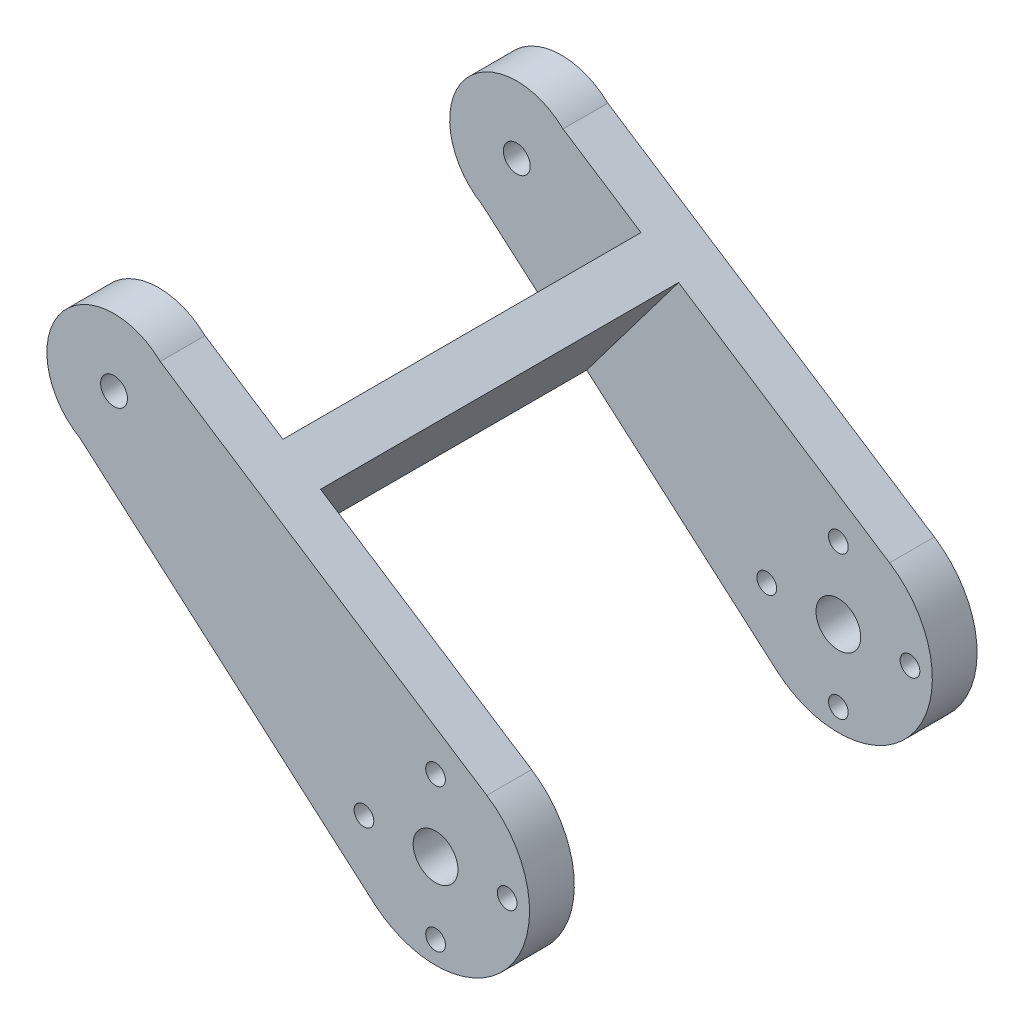
ISO-10303-21;
HEADER;
FILE_DESCRIPTION(('STEP AP214'),'2;1');
FILE_NAME('part.step','',(''),(''),'','','');
FILE_SCHEMA(('AUTOMOTIVE_DESIGN { 1 0 10303 214 1 1 1 1 }'));
ENDSEC;
DATA;
#1=APPLICATION_CONTEXT('core data for automotive mechanical design processes');
#2=APPLICATION_PROTOCOL_DEFINITION('international standard','automotive_design',2000,#1);
#3=PRODUCT_CONTEXT('',#1,'mechanical');
#4=PRODUCT('Part','Part','',(#3));
#5=PRODUCT_RELATED_PRODUCT_CATEGORY('part','',(#4));
#6=PRODUCT_DEFINITION_FORMATION('','',#4);
#7=PRODUCT_DEFINITION_CONTEXT('part definition',#1,'design');
#8=PRODUCT_DEFINITION('design','',#6,#7);
#9=PRODUCT_DEFINITION_SHAPE('','',#8);
#10=(LENGTH_UNIT() NAMED_UNIT(*) SI_UNIT(.MILLI.,.METRE.));
#11=(NAMED_UNIT(*) PLANE_ANGLE_UNIT() SI_UNIT($,.RADIAN.));
#12=(NAMED_UNIT(*) SI_UNIT($,.STERADIAN.) SOLID_ANGLE_UNIT());
#13=UNCERTAINTY_MEASURE_WITH_UNIT(LENGTH_MEASURE(1.E-05),#10,'distance_accuracy_value','');
#14=(GEOMETRIC_REPRESENTATION_CONTEXT(3) GLOBAL_UNCERTAINTY_ASSIGNED_CONTEXT((#13)) GLOBAL_UNIT_ASSIGNED_CONTEXT((#10,
#11,#12)) REPRESENTATION_CONTEXT('',''));
#15=CARTESIAN_POINT('',(0.,0.,0.));
#16=DIRECTION('',(0.,0.,1.));
#17=DIRECTION('',(1.,0.,0.));
#18=AXIS2_PLACEMENT_3D('',#15,#16,#17);
#19=CARTESIAN_POINT('',(0.,0.,0.));
#20=DIRECTION('',(0.,0.,1.));
#21=DIRECTION('',(1.,0.,0.));
#22=AXIS2_PLACEMENT_3D('',#19,#20,#21);
#23=PLANE('',#22);
#24=CARTESIAN_POINT('',(-35.92301936865,27.1023371582526,0.));
#25=DIRECTION('',(0.,0.,1.));
#26=DIRECTION('',(1.,0.,0.));
#27=AXIS2_PLACEMENT_3D('',#24,#25,#26);
#28=CIRCLE('',#27,1.5);
#29=CARTESIAN_POINT('',(-34.42301936865,27.1023371582526,0.));
#30=VERTEX_POINT('',#29);
#31=EDGE_CURVE('E337',#30,#30,#28,.T.);
#32=ORIENTED_EDGE('',*,*,#31,.T.);
#33=EDGE_LOOP('',(#32));
#34=FACE_BOUND('',#33,.T.);
#35=DIRECTION('',(0.602274159072283,0.79828931930333,0.));
#36=VECTOR('',#35,1.);
#37=CARTESIAN_POINT('',(-22.0489943582428,26.8730433291357,0.));
#38=LINE('',#37,#36);
#39=CARTESIAN_POINT('',(-31.8936761340433,13.8243275654257,0.));
#40=VERTEX_POINT('',#39);
#41=CARTESIAN_POINT('',(-22.0489943582428,26.8730433291357,0.));
#42=VERTEX_POINT('',#41);
#43=EDGE_CURVE('E227',#40,#42,#38,.T.);
#44=ORIENTED_EDGE('',*,*,#43,.F.);
#45=DIRECTION('',(0.754527053105432,-0.656268943446231,0.));
#46=VECTOR('',#45,1.);
#47=CARTESIAN_POINT('',(-6.89082390618542,-7.92253405760704,0.));
#48=LINE('',#47,#46);
#49=CARTESIAN_POINT('',(-39.7307534474615,20.6408233120199,0.));
#50=VERTEX_POINT('',#49);
#51=EDGE_CURVE('E257',#50,#40,#48,.T.);
#52=ORIENTED_EDGE('',*,*,#51,.F.);
#53=CARTESIAN_POINT('',(-35.92301936865,27.1023371582526,0.));
#54=DIRECTION('',(0.,0.,1.));
#55=DIRECTION('',(1.,0.,0.));
#56=AXIS2_PLACEMENT_3D('',#53,#54,#55);
#57=CIRCLE('',#56,7.5);
#58=CARTESIAN_POINT('',(-30.7551130525645,32.5376609120104,0.));
#59=VERTEX_POINT('',#58);
#60=EDGE_CURVE('E314',#59,#50,#57,.T.);
#61=ORIENTED_EDGE('',*,*,#60,.F.);
#62=DIRECTION('',(-0.838195390922782,0.54537004559822,0.));
#63=VECTOR('',#62,1.);
#64=CARTESIAN_POINT('',(5.7263854787813,8.80105160468921,0.));
#65=LINE('',#64,#63);
#66=EDGE_CURVE('E50',#42,#59,#65,.T.);
#67=ORIENTED_EDGE('',*,*,#66,.F.);
#68=EDGE_LOOP('',(#44,#52,#61,#67));
#69=FACE_BOUND('',#68,.T.);
#70=ADVANCED_FACE('F33',(#34,#69),#23,.F.);
#71=CARTESIAN_POINT('',(0.,0.,0.));
#72=DIRECTION('',(0.,0.,1.));
#73=DIRECTION('',(1.,0.,0.));
#74=AXIS2_PLACEMENT_3D('',#71,#72,#73);
#75=CIRCLE('',#74,2.5);
#76=CARTESIAN_POINT('',(2.5,0.,0.));
#77=VERTEX_POINT('',#76);
#78=EDGE_CURVE('E315',#77,#77,#75,.T.);
#79=ORIENTED_EDGE('',*,*,#78,.T.);
#80=EDGE_LOOP('',(#79));
#81=FACE_BOUND('',#80,.T.);
#82=CARTESIAN_POINT('',(4.52787916007828E-13,-8.,0.));
#83=DIRECTION('',(0.,0.,1.));
#84=DIRECTION('',(1.,0.,0.));
#85=AXIS2_PLACEMENT_3D('',#82,#83,#84);
#86=CIRCLE('',#85,1.1);
#87=CARTESIAN_POINT('',(1.10000000000045,-8.,0.));
#88=VERTEX_POINT('',#87);
#89=EDGE_CURVE('E325',#88,#88,#86,.T.);
#90=ORIENTED_EDGE('',*,*,#89,.T.);
#91=EDGE_LOOP('',(#90));
#92=FACE_BOUND('',#91,.T.);
#93=CARTESIAN_POINT('',(0.,8.,0.));
#94=DIRECTION('',(0.,0.,1.));
#95=DIRECTION('',(1.,0.,0.));
#96=AXIS2_PLACEMENT_3D('',#93,#94,#95);
#97=CIRCLE('',#96,1.1);
#98=CARTESIAN_POINT('',(1.1,8.,0.));
#99=VERTEX_POINT('',#98);
#100=EDGE_CURVE('E343',#99,#99,#97,.T.);
#101=ORIENTED_EDGE('',*,*,#100,.T.);
#102=EDGE_LOOP('',(#101));
#103=FACE_BOUND('',#102,.T.);
#104=CARTESIAN_POINT('',(8.00000000000023,2.26393958003914E-13,0.));
#105=DIRECTION('',(0.,0.,1.));
#106=DIRECTION('',(1.,0.,0.));
#107=AXIS2_PLACEMENT_3D('',#104,#105,#106);
#108=CIRCLE('',#107,1.1);
#109=CARTESIAN_POINT('',(9.10000000000023,2.26393958003914E-13,0.));
#110=VERTEX_POINT('',#109);
#111=EDGE_CURVE('E331',#110,#110,#108,.T.);
#112=ORIENTED_EDGE('',*,*,#111,.T.);
#113=EDGE_LOOP('',(#112));
#114=FACE_BOUND('',#113,.T.);
#115=CARTESIAN_POINT('',(-7.99999999999977,-2.27373675443232E-13,0.));
#116=DIRECTION('',(0.,0.,1.));
#117=DIRECTION('',(1.,0.,0.));
#118=AXIS2_PLACEMENT_3D('',#115,#116,#117);
#119=CIRCLE('',#118,1.1);
#120=CARTESIAN_POINT('',(-6.89999999999977,-2.27373675443232E-13,0.));
#121=VERTEX_POINT('',#120);
#122=EDGE_CURVE('E320',#121,#121,#119,.T.);
#123=ORIENTED_EDGE('',*,*,#122,.T.);
#124=EDGE_LOOP('',(#123));
#125=FACE_BOUND('',#124,.T.);
#126=DIRECTION('',(-0.602274159072283,-0.79828931930333,0.));
#127=VECTOR('',#126,1.);
#128=CARTESIAN_POINT('',(-17.8478704865239,24.139591031145,0.));
#129=LINE('',#128,#127);
#130=CARTESIAN_POINT('',(-17.847870486524,24.139591031145,0.));
#131=VERTEX_POINT('',#130);
#132=CARTESIAN_POINT('',(-28.1119068127289,10.5350382726937,0.));
#133=VERTEX_POINT('',#132);
#134=EDGE_CURVE('E58',#131,#133,#129,.T.);
#135=ORIENTED_EDGE('',*,*,#134,.F.);
#136=CARTESIAN_POINT('',(5.7263854787813,8.80105160468921,0.));
#137=VERTEX_POINT('',#136);
#138=EDGE_CURVE('E310',#137,#131,#65,.T.);
#139=ORIENTED_EDGE('',*,*,#138,.F.);
#140=CARTESIAN_POINT('',(0.,0.,0.));
#141=DIRECTION('',(0.,0.,1.));
#142=DIRECTION('',(1.,0.,0.));
#143=AXIS2_PLACEMENT_3D('',#140,#141,#142);
#144=CIRCLE('',#143,10.5);
#145=CARTESIAN_POINT('',(-6.89082390618542,-7.92253405760704,0.));
#146=VERTEX_POINT('',#145);
#147=EDGE_CURVE('E348',#146,#137,#144,.T.);
#148=ORIENTED_EDGE('',*,*,#147,.F.);
#149=EDGE_CURVE('E366',#133,#146,#48,.T.);
#150=ORIENTED_EDGE('',*,*,#149,.F.);
#151=EDGE_LOOP('',(#135,#139,#148,#150));
#152=FACE_BOUND('',#151,.T.);
#153=ADVANCED_FACE('F285',(#81,#92,#103,#114,#125,#152),#23,.F.);
#154=CARTESIAN_POINT('',(0.,0.,5.));
#155=DIRECTION('',(0.,0.,1.));
#156=DIRECTION('',(1.,0.,0.));
#157=AXIS2_PLACEMENT_3D('',#154,#155,#156);
#158=PLANE('',#157);
#159=CARTESIAN_POINT('',(-7.99999999999977,-2.27373675443232E-13,5.));
#160=DIRECTION('',(0.,0.,1.));
#161=DIRECTION('',(1.,0.,0.));
#162=AXIS2_PLACEMENT_3D('',#159,#160,#161);
#163=CIRCLE('',#162,1.1);
#164=CARTESIAN_POINT('',(-6.89999999999977,-2.27373675443232E-13,5.));
#165=VERTEX_POINT('',#164);
#166=EDGE_CURVE('E322',#165,#165,#163,.T.);
#167=ORIENTED_EDGE('',*,*,#166,.F.);
#168=EDGE_LOOP('',(#167));
#169=FACE_BOUND('',#168,.T.);
#170=CARTESIAN_POINT('',(8.00000000000023,2.26393958003914E-13,5.));
#171=DIRECTION('',(0.,0.,1.));
#172=DIRECTION('',(1.,0.,0.));
#173=AXIS2_PLACEMENT_3D('',#170,#171,#172);
#174=CIRCLE('',#173,1.1);
#175=CARTESIAN_POINT('',(9.10000000000023,2.26393958003914E-13,5.));
#176=VERTEX_POINT('',#175);
#177=EDGE_CURVE('E334',#176,#176,#174,.T.);
#178=ORIENTED_EDGE('',*,*,#177,.F.);
#179=EDGE_LOOP('',(#178));
#180=FACE_BOUND('',#179,.T.);
#181=CARTESIAN_POINT('',(0.,8.,5.));
#182=DIRECTION('',(0.,0.,1.));
#183=DIRECTION('',(1.,0.,0.));
#184=AXIS2_PLACEMENT_3D('',#181,#182,#183);
#185=CIRCLE('',#184,1.1);
#186=CARTESIAN_POINT('',(1.1,8.,5.));
#187=VERTEX_POINT('',#186);
#188=EDGE_CURVE('E345',#187,#187,#185,.T.);
#189=ORIENTED_EDGE('',*,*,#188,.F.);
#190=EDGE_LOOP('',(#189));
#191=FACE_BOUND('',#190,.T.);
#192=CARTESIAN_POINT('',(0.,0.,5.));
#193=DIRECTION('',(0.,0.,1.));
#194=DIRECTION('',(1.,0.,0.));
#195=AXIS2_PLACEMENT_3D('',#192,#193,#194);
#196=CIRCLE('',#195,10.5);
#197=CARTESIAN_POINT('',(-6.89082390618542,-7.92253405760704,5.));
#198=VERTEX_POINT('',#197);
#199=CARTESIAN_POINT('',(5.7263854787813,8.80105160468921,5.));
#200=VERTEX_POINT('',#199);
#201=EDGE_CURVE('E351',#198,#200,#196,.T.);
#202=ORIENTED_EDGE('',*,*,#201,.T.);
#203=DIRECTION('',(-0.838195390922782,0.54537004559822,0.));
#204=VECTOR('',#203,1.);
#205=CARTESIAN_POINT('',(5.7263854787813,8.80105160468921,5.));
#206=LINE('',#205,#204);
#207=CARTESIAN_POINT('',(-30.7551130525645,32.5376609120104,5.));
#208=VERTEX_POINT('',#207);
#209=EDGE_CURVE('E354',#200,#208,#206,.T.);
#210=ORIENTED_EDGE('',*,*,#209,.T.);
#211=CARTESIAN_POINT('',(-35.92301936865,27.1023371582526,5.));
#212=DIRECTION('',(0.,0.,1.));
#213=DIRECTION('',(1.,0.,0.));
#214=AXIS2_PLACEMENT_3D('',#211,#212,#213);
#215=CIRCLE('',#214,7.5);
#216=CARTESIAN_POINT('',(-39.7307534474615,20.6408233120199,5.));
#217=VERTEX_POINT('',#216);
#218=EDGE_CURVE('E356',#208,#217,#215,.T.);
#219=ORIENTED_EDGE('',*,*,#218,.T.);
#220=DIRECTION('',(0.754527053105432,-0.656268943446231,0.));
#221=VECTOR('',#220,1.);
#222=CARTESIAN_POINT('',(-6.89082390618542,-7.92253405760704,5.));
#223=LINE('',#222,#221);
#224=EDGE_CURVE('E358',#217,#198,#223,.T.);
#225=ORIENTED_EDGE('',*,*,#224,.T.);
#226=EDGE_LOOP('',(#202,#210,#219,#225));
#227=FACE_BOUND('',#226,.T.);
#228=CARTESIAN_POINT('',(-35.92301936865,27.1023371582526,5.));
#229=DIRECTION('',(0.,0.,1.));
#230=DIRECTION('',(1.,0.,0.));
#231=AXIS2_PLACEMENT_3D('',#228,#229,#230);
#232=CIRCLE('',#231,1.5);
#233=CARTESIAN_POINT('',(-34.42301936865,27.1023371582526,5.));
#234=VERTEX_POINT('',#233);
#235=EDGE_CURVE('E340',#234,#234,#232,.T.);
#236=ORIENTED_EDGE('',*,*,#235,.F.);
#237=EDGE_LOOP('',(#236));
#238=FACE_BOUND('',#237,.T.);
#239=CARTESIAN_POINT('',(4.52787916007828E-13,-8.,5.));
#240=DIRECTION('',(0.,0.,1.));
#241=DIRECTION('',(1.,0.,0.));
#242=AXIS2_PLACEMENT_3D('',#239,#240,#241);
#243=CIRCLE('',#242,1.1);
#244=CARTESIAN_POINT('',(1.10000000000045,-8.,5.));
#245=VERTEX_POINT('',#244);
#246=EDGE_CURVE('E328',#245,#245,#243,.T.);
#247=ORIENTED_EDGE('',*,*,#246,.F.);
#248=EDGE_LOOP('',(#247));
#249=FACE_BOUND('',#248,.T.);
#250=CARTESIAN_POINT('',(0.,0.,5.));
#251=DIRECTION('',(0.,0.,1.));
#252=DIRECTION('',(1.,0.,0.));
#253=AXIS2_PLACEMENT_3D('',#250,#251,#252);
#254=CIRCLE('',#253,2.5);
#255=CARTESIAN_POINT('',(2.5,0.,5.));
#256=VERTEX_POINT('',#255);
#257=EDGE_CURVE('E239',#256,#256,#254,.T.);
#258=ORIENTED_EDGE('',*,*,#257,.F.);
#259=EDGE_LOOP('',(#258));
#260=FACE_BOUND('',#259,.T.);
#261=ADVANCED_FACE('F291',(#169,#180,#191,#227,#238,#249,#260),#158,.T.);
#262=CARTESIAN_POINT('',(0.,0.,5.));
#263=DIRECTION('',(0.,0.,-1.));
#264=DIRECTION('',(-1.,0.,0.));
#265=AXIS2_PLACEMENT_3D('',#262,#263,#264);
#266=CYLINDRICAL_SURFACE('',#265,10.5);
#267=ORIENTED_EDGE('',*,*,#147,.T.);
#268=DIRECTION('',(0.,0.,-1.));
#269=VECTOR('',#268,1.);
#270=CARTESIAN_POINT('',(5.7263854787813,8.80105160468921,5.));
#271=LINE('',#270,#269);
#272=EDGE_CURVE('E11',#200,#137,#271,.T.);
#273=ORIENTED_EDGE('',*,*,#272,.F.);
#274=ORIENTED_EDGE('',*,*,#201,.F.);
#275=DIRECTION('',(0.,0.,-1.));
#276=VECTOR('',#275,1.);
#277=CARTESIAN_POINT('',(-6.89082390618542,-7.92253405760704,5.));
#278=LINE('',#277,#276);
#279=EDGE_CURVE('E360',#198,#146,#278,.T.);
#280=ORIENTED_EDGE('',*,*,#279,.T.);
#281=EDGE_LOOP('',(#267,#273,#274,#280));
#282=FACE_BOUND('',#281,.T.);
#283=ADVANCED_FACE('F35',(#282),#266,.T.);
#284=CARTESIAN_POINT('',(5.7263854787813,8.80105160468921,5.));
#285=DIRECTION('',(-0.54537004559822,-0.838195390922782,0.));
#286=DIRECTION('',(0.838195390922782,-0.54537004559822,0.));
#287=AXIS2_PLACEMENT_3D('',#284,#285,#286);
#288=PLANE('',#287);
#289=ORIENTED_EDGE('',*,*,#138,.T.);
#290=DIRECTION('',(0.,0.,1.));
#291=VECTOR('',#290,1.);
#292=CARTESIAN_POINT('',(-17.8478704865239,24.139591031145,-20.));
#293=LINE('',#292,#291);
#294=CARTESIAN_POINT('',(-17.847870486524,24.139591031145,-40.));
#295=VERTEX_POINT('',#294);
#296=EDGE_CURVE('E131',#295,#131,#293,.T.);
#297=ORIENTED_EDGE('',*,*,#296,.F.);
#298=DIRECTION('',(-0.838195390922782,0.54537004559822,0.));
#299=VECTOR('',#298,1.);
#300=CARTESIAN_POINT('',(5.7263854787813,8.80105160468921,-40.));
#301=LINE('',#300,#299);
#302=CARTESIAN_POINT('',(5.7263854787813,8.80105160468921,-40.));
#303=VERTEX_POINT('',#302);
#304=EDGE_CURVE('E149',#303,#295,#301,.T.);
#305=ORIENTED_EDGE('',*,*,#304,.F.);
#306=DIRECTION('',(0.,0.,1.));
#307=VECTOR('',#306,1.);
#308=CARTESIAN_POINT('',(5.7263854787813,8.80105160468921,-45.));
#309=LINE('',#308,#307);
#310=CARTESIAN_POINT('',(5.7263854787813,8.80105160468921,-45.));
#311=VERTEX_POINT('',#310);
#312=EDGE_CURVE('E225',#311,#303,#309,.T.);
#313=ORIENTED_EDGE('',*,*,#312,.F.);
#314=DIRECTION('',(-0.838195390922782,0.54537004559822,0.));
#315=VECTOR('',#314,1.);
#316=CARTESIAN_POINT('',(5.7263854787813,8.80105160468921,-45.));
#317=LINE('',#316,#315);
#318=CARTESIAN_POINT('',(-30.7551130525645,32.5376609120104,-45.));
#319=VERTEX_POINT('',#318);
#320=EDGE_CURVE('E204',#311,#319,#317,.T.);
#321=ORIENTED_EDGE('',*,*,#320,.T.);
#322=DIRECTION('',(0.,0.,1.));
#323=VECTOR('',#322,1.);
#324=CARTESIAN_POINT('',(-30.7551130525645,32.5376609120104,-45.));
#325=LINE('',#324,#323);
#326=CARTESIAN_POINT('',(-30.7551130525645,32.5376609120104,-40.));
#327=VERTEX_POINT('',#326);
#328=EDGE_CURVE('E224',#319,#327,#325,.T.);
#329=ORIENTED_EDGE('',*,*,#328,.T.);
#330=CARTESIAN_POINT('',(-22.0489943582428,26.8730433291357,-40.));
#331=VERTEX_POINT('',#330);
#332=EDGE_CURVE('E157',#331,#327,#301,.T.);
#333=ORIENTED_EDGE('',*,*,#332,.F.);
#334=DIRECTION('',(0.,0.,1.));
#335=VECTOR('',#334,1.);
#336=CARTESIAN_POINT('',(-22.0489943582428,26.8730433291357,-20.));
#337=LINE('',#336,#335);
#338=EDGE_CURVE('E229',#331,#42,#337,.T.);
#339=ORIENTED_EDGE('',*,*,#338,.T.);
#340=ORIENTED_EDGE('',*,*,#66,.T.);
#341=DIRECTION('',(0.,0.,-1.));
#342=VECTOR('',#341,1.);
#343=CARTESIAN_POINT('',(-30.7551130525645,32.5376609120104,5.));
#344=LINE('',#343,#342);
#345=EDGE_CURVE('E42',#208,#59,#344,.T.);
#346=ORIENTED_EDGE('',*,*,#345,.F.);
#347=ORIENTED_EDGE('',*,*,#209,.F.);
#348=ORIENTED_EDGE('',*,*,#272,.T.);
#349=EDGE_LOOP('',(#289,#297,#305,#313,#321,#329,#333,#339,#340,#346,#347,#348));
#350=FACE_BOUND('',#349,.T.);
#351=ADVANCED_FACE('F302',(#350),#288,.F.);
#352=CARTESIAN_POINT('',(-35.92301936865,27.1023371582526,5.));
#353=DIRECTION('',(0.,0.,-1.));
#354=DIRECTION('',(-1.,0.,0.));
#355=AXIS2_PLACEMENT_3D('',#352,#353,#354);
#356=CYLINDRICAL_SURFACE('',#355,7.5);
#357=ORIENTED_EDGE('',*,*,#60,.T.);
#358=DIRECTION('',(0.,0.,-1.));
#359=VECTOR('',#358,1.);
#360=CARTESIAN_POINT('',(-39.7307534474615,20.6408233120199,5.));
#361=LINE('',#360,#359);
#362=EDGE_CURVE('E373',#217,#50,#361,.T.);
#363=ORIENTED_EDGE('',*,*,#362,.F.);
#364=ORIENTED_EDGE('',*,*,#218,.F.);
#365=ORIENTED_EDGE('',*,*,#345,.T.);
#366=EDGE_LOOP('',(#357,#363,#364,#365));
#367=FACE_BOUND('',#366,.T.);
#368=ADVANCED_FACE('F300',(#367),#356,.T.);
#369=CARTESIAN_POINT('',(-6.89082390618542,-7.92253405760704,5.));
#370=DIRECTION('',(0.656268943446231,0.754527053105432,0.));
#371=DIRECTION('',(-0.754527053105432,0.656268943446231,0.));
#372=AXIS2_PLACEMENT_3D('',#369,#370,#371);
#373=PLANE('',#372);
#374=ORIENTED_EDGE('',*,*,#51,.T.);
#375=DIRECTION('',(0.,0.,1.));
#376=VECTOR('',#375,1.);
#377=CARTESIAN_POINT('',(-31.8936761340433,13.8243275654257,-20.));
#378=LINE('',#377,#376);
#379=CARTESIAN_POINT('',(-31.8936761340433,13.8243275654257,-40.));
#380=VERTEX_POINT('',#379);
#381=EDGE_CURVE('E132',#380,#40,#378,.T.);
#382=ORIENTED_EDGE('',*,*,#381,.F.);
#383=DIRECTION('',(0.754527053105432,-0.656268943446231,0.));
#384=VECTOR('',#383,1.);
#385=CARTESIAN_POINT('',(-6.89082390618542,-7.92253405760704,-40.));
#386=LINE('',#385,#384);
#387=CARTESIAN_POINT('',(-39.7307534474615,20.6408233120199,-40.));
#388=VERTEX_POINT('',#387);
#389=EDGE_CURVE('E143',#388,#380,#386,.T.);
#390=ORIENTED_EDGE('',*,*,#389,.F.);
#391=DIRECTION('',(0.,0.,1.));
#392=VECTOR('',#391,1.);
#393=CARTESIAN_POINT('',(-39.7307534474615,20.6408233120199,-45.));
#394=LINE('',#393,#392);
#395=CARTESIAN_POINT('',(-39.7307534474615,20.6408233120199,-45.));
#396=VERTEX_POINT('',#395);
#397=EDGE_CURVE('E222',#396,#388,#394,.T.);
#398=ORIENTED_EDGE('',*,*,#397,.F.);
#399=DIRECTION('',(0.754527053105432,-0.656268943446231,0.));
#400=VECTOR('',#399,1.);
#401=CARTESIAN_POINT('',(-6.89082390618542,-7.92253405760704,-45.));
#402=LINE('',#401,#400);
#403=CARTESIAN_POINT('',(-6.89082390618542,-7.92253405760704,-45.));
#404=VERTEX_POINT('',#403);
#405=EDGE_CURVE('E210',#396,#404,#402,.T.);
#406=ORIENTED_EDGE('',*,*,#405,.T.);
#407=DIRECTION('',(0.,0.,1.));
#408=VECTOR('',#407,1.);
#409=CARTESIAN_POINT('',(-6.89082390618542,-7.92253405760704,-45.));
#410=LINE('',#409,#408);
#411=CARTESIAN_POINT('',(-6.89082390618542,-7.92253405760704,-40.));
#412=VERTEX_POINT('',#411);
#413=EDGE_CURVE('E139',#404,#412,#410,.T.);
#414=ORIENTED_EDGE('',*,*,#413,.T.);
#415=CARTESIAN_POINT('',(-28.1119068127289,10.5350382726937,-40.));
#416=VERTEX_POINT('',#415);
#417=EDGE_CURVE('E135',#416,#412,#386,.T.);
#418=ORIENTED_EDGE('',*,*,#417,.F.);
#419=DIRECTION('',(0.,0.,1.));
#420=VECTOR('',#419,1.);
#421=CARTESIAN_POINT('',(-28.1119068127289,10.5350382726937,-20.));
#422=LINE('',#421,#420);
#423=EDGE_CURVE('E124',#416,#133,#422,.T.);
#424=ORIENTED_EDGE('',*,*,#423,.T.);
#425=ORIENTED_EDGE('',*,*,#149,.T.);
#426=ORIENTED_EDGE('',*,*,#279,.F.);
#427=ORIENTED_EDGE('',*,*,#224,.F.);
#428=ORIENTED_EDGE('',*,*,#362,.T.);
#429=EDGE_LOOP('',(#374,#382,#390,#398,#406,#414,#418,#424,#425,#426,#427,#428));
#430=FACE_BOUND('',#429,.T.);
#431=ADVANCED_FACE('F137',(#430),#373,.F.);
#432=CARTESIAN_POINT('',(0.,8.,5.));
#433=DIRECTION('',(0.,0.,-1.));
#434=DIRECTION('',(-1.,0.,0.));
#435=AXIS2_PLACEMENT_3D('',#432,#433,#434);
#436=CYLINDRICAL_SURFACE('',#435,1.1);
#437=ORIENTED_EDGE('',*,*,#188,.T.);
#438=EDGE_LOOP('',(#437));
#439=FACE_BOUND('',#438,.T.);
#440=ORIENTED_EDGE('',*,*,#100,.F.);
#441=EDGE_LOOP('',(#440));
#442=FACE_BOUND('',#441,.T.);
#443=ADVANCED_FACE('F299',(#439,#442),#436,.F.);
#444=CARTESIAN_POINT('',(-35.92301936865,27.1023371582526,5.));
#445=DIRECTION('',(0.,0.,-1.));
#446=DIRECTION('',(-1.,0.,0.));
#447=AXIS2_PLACEMENT_3D('',#444,#445,#446);
#448=CYLINDRICAL_SURFACE('',#447,1.5);
#449=ORIENTED_EDGE('',*,*,#235,.T.);
#450=EDGE_LOOP('',(#449));
#451=FACE_BOUND('',#450,.T.);
#452=ORIENTED_EDGE('',*,*,#31,.F.);
#453=EDGE_LOOP('',(#452));
#454=FACE_BOUND('',#453,.T.);
#455=ADVANCED_FACE('F412',(#451,#454),#448,.F.);
#456=CARTESIAN_POINT('',(8.00000000000023,2.26393958003914E-13,5.));
#457=DIRECTION('',(0.,0.,-1.));
#458=DIRECTION('',(-1.,0.,0.));
#459=AXIS2_PLACEMENT_3D('',#456,#457,#458);
#460=CYLINDRICAL_SURFACE('',#459,1.1);
#461=ORIENTED_EDGE('',*,*,#177,.T.);
#462=EDGE_LOOP('',(#461));
#463=FACE_BOUND('',#462,.T.);
#464=ORIENTED_EDGE('',*,*,#111,.F.);
#465=EDGE_LOOP('',(#464));
#466=FACE_BOUND('',#465,.T.);
#467=ADVANCED_FACE('F408',(#463,#466),#460,.F.);
#468=CARTESIAN_POINT('',(4.52787916007828E-13,-8.,5.));
#469=DIRECTION('',(0.,0.,-1.));
#470=DIRECTION('',(-1.,0.,0.));
#471=AXIS2_PLACEMENT_3D('',#468,#469,#470);
#472=CYLINDRICAL_SURFACE('',#471,1.1);
#473=ORIENTED_EDGE('',*,*,#246,.T.);
#474=EDGE_LOOP('',(#473));
#475=FACE_BOUND('',#474,.T.);
#476=ORIENTED_EDGE('',*,*,#89,.F.);
#477=EDGE_LOOP('',(#476));
#478=FACE_BOUND('',#477,.T.);
#479=ADVANCED_FACE('F402',(#475,#478),#472,.F.);
#480=CARTESIAN_POINT('',(-7.99999999999977,-2.27373675443232E-13,5.));
#481=DIRECTION('',(0.,0.,-1.));
#482=DIRECTION('',(-1.,0.,0.));
#483=AXIS2_PLACEMENT_3D('',#480,#481,#482);
#484=CYLINDRICAL_SURFACE('',#483,1.1);
#485=ORIENTED_EDGE('',*,*,#166,.T.);
#486=EDGE_LOOP('',(#485));
#487=FACE_BOUND('',#486,.T.);
#488=ORIENTED_EDGE('',*,*,#122,.F.);
#489=EDGE_LOOP('',(#488));
#490=FACE_BOUND('',#489,.T.);
#491=ADVANCED_FACE('F395',(#487,#490),#484,.F.);
#492=CARTESIAN_POINT('',(0.,0.,5.));
#493=DIRECTION('',(0.,0.,-1.));
#494=DIRECTION('',(-1.,0.,0.));
#495=AXIS2_PLACEMENT_3D('',#492,#493,#494);
#496=CYLINDRICAL_SURFACE('',#495,2.5);
#497=ORIENTED_EDGE('',*,*,#257,.T.);
#498=EDGE_LOOP('',(#497));
#499=FACE_BOUND('',#498,.T.);
#500=ORIENTED_EDGE('',*,*,#78,.F.);
#501=EDGE_LOOP('',(#500));
#502=FACE_BOUND('',#501,.T.);
#503=ADVANCED_FACE('F392',(#499,#502),#496,.F.);
#504=CARTESIAN_POINT('',(-17.8478704865239,24.139591031145,-20.));
#505=DIRECTION('',(-0.79828931930333,0.602274159072283,0.));
#506=DIRECTION('',(-0.602274159072283,-0.79828931930333,0.));
#507=AXIS2_PLACEMENT_3D('',#504,#505,#506);
#508=PLANE('',#507);
#509=ORIENTED_EDGE('',*,*,#134,.T.);
#510=ORIENTED_EDGE('',*,*,#423,.F.);
#511=DIRECTION('',(-0.602274159072283,-0.79828931930333,0.));
#512=VECTOR('',#511,1.);
#513=CARTESIAN_POINT('',(-17.8478704865239,24.139591031145,-40.));
#514=LINE('',#513,#512);
#515=EDGE_CURVE('E129',#295,#416,#514,.T.);
#516=ORIENTED_EDGE('',*,*,#515,.F.);
#517=ORIENTED_EDGE('',*,*,#296,.T.);
#518=EDGE_LOOP('',(#509,#510,#516,#517));
#519=FACE_BOUND('',#518,.T.);
#520=ADVANCED_FACE('F126',(#519),#508,.F.);
#521=CARTESIAN_POINT('',(-22.0489943582428,26.8730433291357,-20.));
#522=DIRECTION('',(0.79828931930333,-0.602274159072283,0.));
#523=DIRECTION('',(0.602274159072283,0.79828931930333,0.));
#524=AXIS2_PLACEMENT_3D('',#521,#522,#523);
#525=PLANE('',#524);
#526=ORIENTED_EDGE('',*,*,#43,.T.);
#527=ORIENTED_EDGE('',*,*,#338,.F.);
#528=DIRECTION('',(0.602274159072283,0.79828931930333,0.));
#529=VECTOR('',#528,1.);
#530=CARTESIAN_POINT('',(-22.0489943582428,26.8730433291357,-40.));
#531=LINE('',#530,#529);
#532=EDGE_CURVE('E150',#380,#331,#531,.T.);
#533=ORIENTED_EDGE('',*,*,#532,.F.);
#534=ORIENTED_EDGE('',*,*,#381,.T.);
#535=EDGE_LOOP('',(#526,#527,#533,#534));
#536=FACE_BOUND('',#535,.T.);
#537=ADVANCED_FACE('F251',(#536),#525,.F.);
#538=CARTESIAN_POINT('',(0.,0.,-40.));
#539=DIRECTION('',(0.,0.,-1.));
#540=DIRECTION('',(1.,0.,0.));
#541=AXIS2_PLACEMENT_3D('',#538,#539,#540);
#542=PLANE('',#541);
#543=CARTESIAN_POINT('',(-35.92301936865,27.1023371582526,-40.));
#544=DIRECTION('',(0.,0.,1.));
#545=DIRECTION('',(1.,0.,0.));
#546=AXIS2_PLACEMENT_3D('',#543,#544,#545);
#547=CIRCLE('',#546,1.5);
#548=CARTESIAN_POINT('',(-34.42301936865,27.1023371582526,-40.));
#549=VERTEX_POINT('',#548);
#550=EDGE_CURVE('E186',#549,#549,#547,.T.);
#551=ORIENTED_EDGE('',*,*,#550,.F.);
#552=EDGE_LOOP('',(#551));
#553=FACE_BOUND('',#552,.T.);
#554=ORIENTED_EDGE('',*,*,#532,.T.);
#555=ORIENTED_EDGE('',*,*,#332,.T.);
#556=CARTESIAN_POINT('',(-35.92301936865,27.1023371582526,-40.));
#557=DIRECTION('',(0.,0.,1.));
#558=DIRECTION('',(1.,0.,0.));
#559=AXIS2_PLACEMENT_3D('',#556,#557,#558);
#560=CIRCLE('',#559,7.5);
#561=EDGE_CURVE('E144',#327,#388,#560,.T.);
#562=ORIENTED_EDGE('',*,*,#561,.T.);
#563=ORIENTED_EDGE('',*,*,#389,.T.);
#564=EDGE_LOOP('',(#554,#555,#562,#563));
#565=FACE_BOUND('',#564,.T.);
#566=ADVANCED_FACE('F259',(#553,#565),#542,.F.);
#567=CARTESIAN_POINT('',(0.,0.,-40.));
#568=DIRECTION('',(0.,0.,1.));
#569=DIRECTION('',(1.,0.,0.));
#570=AXIS2_PLACEMENT_3D('',#567,#568,#569);
#571=CIRCLE('',#570,2.5);
#572=CARTESIAN_POINT('',(2.5,0.,-40.));
#573=VERTEX_POINT('',#572);
#574=EDGE_CURVE('E153',#573,#573,#571,.T.);
#575=ORIENTED_EDGE('',*,*,#574,.F.);
#576=EDGE_LOOP('',(#575));
#577=FACE_BOUND('',#576,.T.);
#578=CARTESIAN_POINT('',(4.52787916007828E-13,-8.,-40.));
#579=DIRECTION('',(0.,0.,1.));
#580=DIRECTION('',(1.,0.,0.));
#581=AXIS2_PLACEMENT_3D('',#578,#579,#580);
#582=CIRCLE('',#581,1.1);
#583=CARTESIAN_POINT('',(1.10000000000045,-8.,-40.));
#584=VERTEX_POINT('',#583);
#585=EDGE_CURVE('E174',#584,#584,#582,.T.);
#586=ORIENTED_EDGE('',*,*,#585,.F.);
#587=EDGE_LOOP('',(#586));
#588=FACE_BOUND('',#587,.T.);
#589=CARTESIAN_POINT('',(0.,8.,-40.));
#590=DIRECTION('',(0.,0.,1.));
#591=DIRECTION('',(1.,0.,0.));
#592=AXIS2_PLACEMENT_3D('',#589,#590,#591);
#593=CIRCLE('',#592,1.1);
#594=CARTESIAN_POINT('',(1.1,8.,-40.));
#595=VERTEX_POINT('',#594);
#596=EDGE_CURVE('E192',#595,#595,#593,.T.);
#597=ORIENTED_EDGE('',*,*,#596,.F.);
#598=EDGE_LOOP('',(#597));
#599=FACE_BOUND('',#598,.T.);
#600=CARTESIAN_POINT('',(8.00000000000023,2.26393958003914E-13,-40.));
#601=DIRECTION('',(0.,0.,1.));
#602=DIRECTION('',(1.,0.,0.));
#603=AXIS2_PLACEMENT_3D('',#600,#601,#602);
#604=CIRCLE('',#603,1.1);
#605=CARTESIAN_POINT('',(9.10000000000023,2.26393958003914E-13,-40.));
#606=VERTEX_POINT('',#605);
#607=EDGE_CURVE('E180',#606,#606,#604,.T.);
#608=ORIENTED_EDGE('',*,*,#607,.F.);
#609=EDGE_LOOP('',(#608));
#610=FACE_BOUND('',#609,.T.);
#611=CARTESIAN_POINT('',(-7.99999999999977,-2.27373675443232E-13,-40.));
#612=DIRECTION('',(0.,0.,1.));
#613=DIRECTION('',(1.,0.,0.));
#614=AXIS2_PLACEMENT_3D('',#611,#612,#613);
#615=CIRCLE('',#614,1.1);
#616=CARTESIAN_POINT('',(-6.89999999999977,-2.27373675443232E-13,-40.));
#617=VERTEX_POINT('',#616);
#618=EDGE_CURVE('E168',#617,#617,#615,.T.);
#619=ORIENTED_EDGE('',*,*,#618,.F.);
#620=EDGE_LOOP('',(#619));
#621=FACE_BOUND('',#620,.T.);
#622=ORIENTED_EDGE('',*,*,#515,.T.);
#623=ORIENTED_EDGE('',*,*,#417,.T.);
#624=CARTESIAN_POINT('',(0.,0.,-40.));
#625=DIRECTION('',(0.,0.,1.));
#626=DIRECTION('',(1.,0.,0.));
#627=AXIS2_PLACEMENT_3D('',#624,#625,#626);
#628=CIRCLE('',#627,10.5);
#629=EDGE_CURVE('E198',#412,#303,#628,.T.);
#630=ORIENTED_EDGE('',*,*,#629,.T.);
#631=ORIENTED_EDGE('',*,*,#304,.T.);
#632=EDGE_LOOP('',(#622,#623,#630,#631));
#633=FACE_BOUND('',#632,.T.);
#634=ADVANCED_FACE('F147',(#577,#588,#599,#610,#621,#633),#542,.F.);
#635=CARTESIAN_POINT('',(0.,0.,-45.));
#636=DIRECTION('',(0.,0.,-1.));
#637=DIRECTION('',(1.,0.,0.));
#638=AXIS2_PLACEMENT_3D('',#635,#636,#637);
#639=PLANE('',#638);
#640=CARTESIAN_POINT('',(-7.99999999999977,-2.27373675443232E-13,-45.));
#641=DIRECTION('',(0.,0.,1.));
#642=DIRECTION('',(1.,0.,0.));
#643=AXIS2_PLACEMENT_3D('',#640,#641,#642);
#644=CIRCLE('',#643,1.1);
#645=CARTESIAN_POINT('',(-6.89999999999977,-2.27373675443232E-13,-45.));
#646=VERTEX_POINT('',#645);
#647=EDGE_CURVE('E171',#646,#646,#644,.T.);
#648=ORIENTED_EDGE('',*,*,#647,.T.);
#649=EDGE_LOOP('',(#648));
#650=FACE_BOUND('',#649,.T.);
#651=CARTESIAN_POINT('',(8.00000000000023,2.26393958003914E-13,-45.));
#652=DIRECTION('',(0.,0.,1.));
#653=DIRECTION('',(1.,0.,0.));
#654=AXIS2_PLACEMENT_3D('',#651,#652,#653);
#655=CIRCLE('',#654,1.1);
#656=CARTESIAN_POINT('',(9.10000000000023,2.26393958003914E-13,-45.));
#657=VERTEX_POINT('',#656);
#658=EDGE_CURVE('E183',#657,#657,#655,.T.);
#659=ORIENTED_EDGE('',*,*,#658,.T.);
#660=EDGE_LOOP('',(#659));
#661=FACE_BOUND('',#660,.T.);
#662=CARTESIAN_POINT('',(0.,8.,-45.));
#663=DIRECTION('',(0.,0.,1.));
#664=DIRECTION('',(1.,0.,0.));
#665=AXIS2_PLACEMENT_3D('',#662,#663,#664);
#666=CIRCLE('',#665,1.1);
#667=CARTESIAN_POINT('',(1.1,8.,-45.));
#668=VERTEX_POINT('',#667);
#669=EDGE_CURVE('E195',#668,#668,#666,.T.);
#670=ORIENTED_EDGE('',*,*,#669,.T.);
#671=EDGE_LOOP('',(#670));
#672=FACE_BOUND('',#671,.T.);
#673=CARTESIAN_POINT('',(0.,0.,-45.));
#674=DIRECTION('',(0.,0.,1.));
#675=DIRECTION('',(1.,0.,0.));
#676=AXIS2_PLACEMENT_3D('',#673,#674,#675);
#677=CIRCLE('',#676,10.5);
#678=EDGE_CURVE('E201',#404,#311,#677,.T.);
#679=ORIENTED_EDGE('',*,*,#678,.F.);
#680=ORIENTED_EDGE('',*,*,#405,.F.);
#681=CARTESIAN_POINT('',(-35.92301936865,27.1023371582526,-45.));
#682=DIRECTION('',(0.,0.,1.));
#683=DIRECTION('',(1.,0.,0.));
#684=AXIS2_PLACEMENT_3D('',#681,#682,#683);
#685=CIRCLE('',#684,7.5);
#686=EDGE_CURVE('E207',#319,#396,#685,.T.);
#687=ORIENTED_EDGE('',*,*,#686,.F.);
#688=ORIENTED_EDGE('',*,*,#320,.F.);
#689=EDGE_LOOP('',(#679,#680,#687,#688));
#690=FACE_BOUND('',#689,.T.);
#691=CARTESIAN_POINT('',(-35.92301936865,27.1023371582526,-45.));
#692=DIRECTION('',(0.,0.,1.));
#693=DIRECTION('',(1.,0.,0.));
#694=AXIS2_PLACEMENT_3D('',#691,#692,#693);
#695=CIRCLE('',#694,1.5);
#696=CARTESIAN_POINT('',(-34.42301936865,27.1023371582526,-45.));
#697=VERTEX_POINT('',#696);
#698=EDGE_CURVE('E189',#697,#697,#695,.T.);
#699=ORIENTED_EDGE('',*,*,#698,.T.);
#700=EDGE_LOOP('',(#699));
#701=FACE_BOUND('',#700,.T.);
#702=CARTESIAN_POINT('',(4.52787916007828E-13,-8.,-45.));
#703=DIRECTION('',(0.,0.,1.));
#704=DIRECTION('',(1.,0.,0.));
#705=AXIS2_PLACEMENT_3D('',#702,#703,#704);
#706=CIRCLE('',#705,1.1);
#707=CARTESIAN_POINT('',(1.10000000000045,-8.,-45.));
#708=VERTEX_POINT('',#707);
#709=EDGE_CURVE('E177',#708,#708,#706,.T.);
#710=ORIENTED_EDGE('',*,*,#709,.T.);
#711=EDGE_LOOP('',(#710));
#712=FACE_BOUND('',#711,.T.);
#713=CARTESIAN_POINT('',(0.,0.,-45.));
#714=DIRECTION('',(0.,0.,1.));
#715=DIRECTION('',(1.,0.,0.));
#716=AXIS2_PLACEMENT_3D('',#713,#714,#715);
#717=CIRCLE('',#716,2.5);
#718=CARTESIAN_POINT('',(2.5,0.,-45.));
#719=VERTEX_POINT('',#718);
#720=EDGE_CURVE('E165',#719,#719,#717,.T.);
#721=ORIENTED_EDGE('',*,*,#720,.T.);
#722=EDGE_LOOP('',(#721));
#723=FACE_BOUND('',#722,.T.);
#724=ADVANCED_FACE('F270',(#650,#661,#672,#690,#701,#712,#723),#639,.T.);
#725=CARTESIAN_POINT('',(0.,0.,-45.));
#726=DIRECTION('',(0.,0.,1.));
#727=DIRECTION('',(-1.,0.,0.));
#728=AXIS2_PLACEMENT_3D('',#725,#726,#727);
#729=CYLINDRICAL_SURFACE('',#728,10.5);
#730=ORIENTED_EDGE('',*,*,#629,.F.);
#731=ORIENTED_EDGE('',*,*,#413,.F.);
#732=ORIENTED_EDGE('',*,*,#678,.T.);
#733=ORIENTED_EDGE('',*,*,#312,.T.);
#734=EDGE_LOOP('',(#730,#731,#732,#733));
#735=FACE_BOUND('',#734,.T.);
#736=ADVANCED_FACE('F272',(#735),#729,.T.);
#737=CARTESIAN_POINT('',(-35.92301936865,27.1023371582526,-45.));
#738=DIRECTION('',(0.,0.,1.));
#739=DIRECTION('',(-1.,0.,0.));
#740=AXIS2_PLACEMENT_3D('',#737,#738,#739);
#741=CYLINDRICAL_SURFACE('',#740,7.5);
#742=ORIENTED_EDGE('',*,*,#561,.F.);
#743=ORIENTED_EDGE('',*,*,#328,.F.);
#744=ORIENTED_EDGE('',*,*,#686,.T.);
#745=ORIENTED_EDGE('',*,*,#397,.T.);
#746=EDGE_LOOP('',(#742,#743,#744,#745));
#747=FACE_BOUND('',#746,.T.);
#748=ADVANCED_FACE('F264',(#747),#741,.T.);
#749=CARTESIAN_POINT('',(0.,8.,-45.));
#750=DIRECTION('',(0.,0.,1.));
#751=DIRECTION('',(-1.,0.,0.));
#752=AXIS2_PLACEMENT_3D('',#749,#750,#751);
#753=CYLINDRICAL_SURFACE('',#752,1.1);
#754=ORIENTED_EDGE('',*,*,#669,.F.);
#755=EDGE_LOOP('',(#754));
#756=FACE_BOUND('',#755,.T.);
#757=ORIENTED_EDGE('',*,*,#596,.T.);
#758=EDGE_LOOP('',(#757));
#759=FACE_BOUND('',#758,.T.);
#760=ADVANCED_FACE('F279',(#756,#759),#753,.F.);
#761=CARTESIAN_POINT('',(-35.92301936865,27.1023371582526,-45.));
#762=DIRECTION('',(0.,0.,1.));
#763=DIRECTION('',(-1.,0.,0.));
#764=AXIS2_PLACEMENT_3D('',#761,#762,#763);
#765=CYLINDRICAL_SURFACE('',#764,1.5);
#766=ORIENTED_EDGE('',*,*,#698,.F.);
#767=EDGE_LOOP('',(#766));
#768=FACE_BOUND('',#767,.T.);
#769=ORIENTED_EDGE('',*,*,#550,.T.);
#770=EDGE_LOOP('',(#769));
#771=FACE_BOUND('',#770,.T.);
#772=ADVANCED_FACE('F529',(#768,#771),#765,.F.);
#773=CARTESIAN_POINT('',(8.00000000000023,2.26393958003914E-13,-45.));
#774=DIRECTION('',(0.,0.,1.));
#775=DIRECTION('',(-1.,0.,0.));
#776=AXIS2_PLACEMENT_3D('',#773,#774,#775);
#777=CYLINDRICAL_SURFACE('',#776,1.1);
#778=ORIENTED_EDGE('',*,*,#658,.F.);
#779=EDGE_LOOP('',(#778));
#780=FACE_BOUND('',#779,.T.);
#781=ORIENTED_EDGE('',*,*,#607,.T.);
#782=EDGE_LOOP('',(#781));
#783=FACE_BOUND('',#782,.T.);
#784=ADVANCED_FACE('F539',(#780,#783),#777,.F.);
#785=CARTESIAN_POINT('',(4.52787916007828E-13,-8.,-45.));
#786=DIRECTION('',(0.,0.,1.));
#787=DIRECTION('',(-1.,0.,0.));
#788=AXIS2_PLACEMENT_3D('',#785,#786,#787);
#789=CYLINDRICAL_SURFACE('',#788,1.1);
#790=ORIENTED_EDGE('',*,*,#709,.F.);
#791=EDGE_LOOP('',(#790));
#792=FACE_BOUND('',#791,.T.);
#793=ORIENTED_EDGE('',*,*,#585,.T.);
#794=EDGE_LOOP('',(#793));
#795=FACE_BOUND('',#794,.T.);
#796=ADVANCED_FACE('F549',(#792,#795),#789,.F.);
#797=CARTESIAN_POINT('',(-7.99999999999977,-2.27373675443232E-13,-45.));
#798=DIRECTION('',(0.,0.,1.));
#799=DIRECTION('',(-1.,0.,0.));
#800=AXIS2_PLACEMENT_3D('',#797,#798,#799);
#801=CYLINDRICAL_SURFACE('',#800,1.1);
#802=ORIENTED_EDGE('',*,*,#647,.F.);
#803=EDGE_LOOP('',(#802));
#804=FACE_BOUND('',#803,.T.);
#805=ORIENTED_EDGE('',*,*,#618,.T.);
#806=EDGE_LOOP('',(#805));
#807=FACE_BOUND('',#806,.T.);
#808=ADVANCED_FACE('F559',(#804,#807),#801,.F.);
#809=CARTESIAN_POINT('',(0.,0.,-45.));
#810=DIRECTION('',(0.,0.,1.));
#811=DIRECTION('',(-1.,0.,0.));
#812=AXIS2_PLACEMENT_3D('',#809,#810,#811);
#813=CYLINDRICAL_SURFACE('',#812,2.5);
#814=ORIENTED_EDGE('',*,*,#720,.F.);
#815=EDGE_LOOP('',(#814));
#816=FACE_BOUND('',#815,.T.);
#817=ORIENTED_EDGE('',*,*,#574,.T.);
#818=EDGE_LOOP('',(#817));
#819=FACE_BOUND('',#818,.T.);
#820=ADVANCED_FACE('F569',(#816,#819),#813,.F.);
#821=CLOSED_SHELL('',(#70,#153,#261,#283,#351,#368,#431,#443,#455,#467,#479,#491,#503,#520,#537,
#566,#634,#724,#736,#748,#760,#772,#784,#796,#808,#820));
#822=MANIFOLD_SOLID_BREP('B2',#821);
#823=ADVANCED_BREP_SHAPE_REPRESENTATION('',(#18,#822),#14);
#824=SHAPE_DEFINITION_REPRESENTATION(#9,#823);
ENDSEC;
END-ISO-10303-21;
